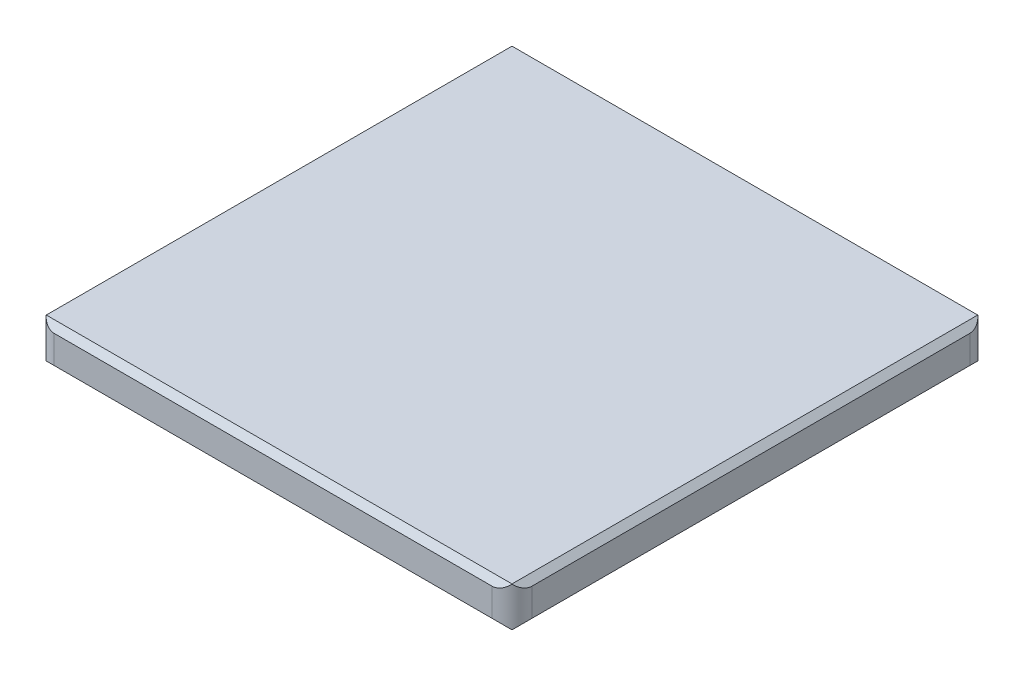
ISO-10303-21;
HEADER;
FILE_DESCRIPTION(('STEP AP214'),'2;1');
FILE_NAME('part.step','',(''),(''),'','','');
FILE_SCHEMA(('AUTOMOTIVE_DESIGN { 1 0 10303 214 1 1 1 1 }'));
ENDSEC;
DATA;
#1=APPLICATION_CONTEXT('core data for automotive mechanical design processes');
#2=APPLICATION_PROTOCOL_DEFINITION('international standard','automotive_design',2000,#1);
#3=PRODUCT_CONTEXT('',#1,'mechanical');
#4=PRODUCT('Part','Part','',(#3));
#5=PRODUCT_RELATED_PRODUCT_CATEGORY('part','',(#4));
#6=PRODUCT_DEFINITION_FORMATION('','',#4);
#7=PRODUCT_DEFINITION_CONTEXT('part definition',#1,'design');
#8=PRODUCT_DEFINITION('design','',#6,#7);
#9=PRODUCT_DEFINITION_SHAPE('','',#8);
#10=(LENGTH_UNIT() NAMED_UNIT(*) SI_UNIT(.MILLI.,.METRE.));
#11=(NAMED_UNIT(*) PLANE_ANGLE_UNIT() SI_UNIT($,.RADIAN.));
#12=(NAMED_UNIT(*) SI_UNIT($,.STERADIAN.) SOLID_ANGLE_UNIT());
#13=UNCERTAINTY_MEASURE_WITH_UNIT(LENGTH_MEASURE(1.E-05),#10,'distance_accuracy_value','');
#14=(GEOMETRIC_REPRESENTATION_CONTEXT(3) GLOBAL_UNCERTAINTY_ASSIGNED_CONTEXT((#13)) GLOBAL_UNIT_ASSIGNED_CONTEXT((#10,
#11,#12)) REPRESENTATION_CONTEXT('',''));
#15=CARTESIAN_POINT('',(0.,0.,0.));
#16=DIRECTION('',(0.,0.,1.));
#17=DIRECTION('',(1.,0.,0.));
#18=AXIS2_PLACEMENT_3D('',#15,#16,#17);
#19=CARTESIAN_POINT('',(152.4,3.81,152.4));
#20=DIRECTION('',(-0.707106781186547,0.707106781186548,0.));
#21=DIRECTION('',(0.,0.,-1.));
#22=AXIS2_PLACEMENT_3D('',#19,#20,#21);
#23=PLANE('',#22);
#24=DIRECTION('',(-0.577350269189625,-0.577350269189624,0.577350269189628));
#25=VECTOR('',#24,1.);
#26=CARTESIAN_POINT('',(152.4,3.81,-152.4));
#27=LINE('',#26,#25);
#28=CARTESIAN_POINT('',(148.680256121069,0.0902561210691833,-148.680256121069));
#29=VERTEX_POINT('',#28);
#30=CARTESIAN_POINT('',(148.59,0.,-148.59));
#31=VERTEX_POINT('',#30);
#32=EDGE_CURVE('E159',#29,#31,#27,.T.);
#33=ORIENTED_EDGE('',*,*,#32,.F.);
#34=CARTESIAN_POINT('',(139.7,-8.88999999999997,-139.7));
#35=DIRECTION('',(-0.707106781186547,0.707106781186548,0.));
#36=DIRECTION('',(-0.707106781186548,-0.707106781186547,0.));
#37=AXIS2_PLACEMENT_3D('',#34,#35,#36);
#38=ELLIPSE('',#37,17.9605122421383,12.7);
#39=CARTESIAN_POINT('',(152.4,3.81,-139.7));
#40=VERTEX_POINT('',#39);
#41=EDGE_CURVE('E273',#29,#40,#38,.F.);
#42=ORIENTED_EDGE('',*,*,#41,.T.);
#43=DIRECTION('',(0.,0.,-1.));
#44=VECTOR('',#43,1.);
#45=CARTESIAN_POINT('',(152.4,3.81,152.4));
#46=LINE('',#45,#44);
#47=CARTESIAN_POINT('',(152.4,3.81,139.7));
#48=VERTEX_POINT('',#47);
#49=EDGE_CURVE('E205',#48,#40,#46,.T.);
#50=ORIENTED_EDGE('',*,*,#49,.F.);
#51=CARTESIAN_POINT('',(139.7,-8.88999999999997,139.7));
#52=DIRECTION('',(-0.707106781186547,0.707106781186548,0.));
#53=DIRECTION('',(-0.707106781186548,-0.707106781186547,0.));
#54=AXIS2_PLACEMENT_3D('',#51,#52,#53);
#55=ELLIPSE('',#54,17.9605122421383,12.7);
#56=CARTESIAN_POINT('',(148.680256121069,0.0902561210691689,148.680256121069));
#57=VERTEX_POINT('',#56);
#58=EDGE_CURVE('E270',#48,#57,#55,.F.);
#59=ORIENTED_EDGE('',*,*,#58,.T.);
#60=DIRECTION('',(-0.577350269189627,-0.577350269189626,-0.577350269189625));
#61=VECTOR('',#60,1.);
#62=CARTESIAN_POINT('',(152.4,3.81,152.4));
#63=LINE('',#62,#61);
#64=CARTESIAN_POINT('',(148.59,0.,148.59));
#65=VERTEX_POINT('',#64);
#66=EDGE_CURVE('E172',#57,#65,#63,.T.);
#67=ORIENTED_EDGE('',*,*,#66,.T.);
#68=DIRECTION('',(0.,0.,1.));
#69=VECTOR('',#68,1.);
#70=CARTESIAN_POINT('',(148.59,0.,0.));
#71=LINE('',#70,#69);
#72=EDGE_CURVE('E178',#31,#65,#71,.T.);
#73=ORIENTED_EDGE('',*,*,#72,.F.);
#74=EDGE_LOOP('',(#33,#42,#50,#59,#67,#73));
#75=FACE_BOUND('',#74,.T.);
#76=ADVANCED_FACE('F45',(#75),#23,.F.);
#77=CARTESIAN_POINT('',(152.4,3.81,152.4));
#78=DIRECTION('',(0.,0.707106781186547,-0.707106781186548));
#79=DIRECTION('',(1.,0.,0.));
#80=AXIS2_PLACEMENT_3D('',#77,#78,#79);
#81=PLANE('',#80);
#82=ORIENTED_EDGE('',*,*,#66,.F.);
#83=CARTESIAN_POINT('',(139.7,-8.89000000000001,139.7));
#84=DIRECTION('',(0.,0.707106781186547,-0.707106781186548));
#85=DIRECTION('',(0.,-0.707106781186548,-0.707106781186547));
#86=AXIS2_PLACEMENT_3D('',#83,#84,#85);
#87=ELLIPSE('',#86,17.9605122421383,12.7);
#88=CARTESIAN_POINT('',(139.7,3.81,152.4));
#89=VERTEX_POINT('',#88);
#90=EDGE_CURVE('E298',#57,#89,#87,.F.);
#91=ORIENTED_EDGE('',*,*,#90,.T.);
#92=DIRECTION('',(1.,0.,0.));
#93=VECTOR('',#92,1.);
#94=CARTESIAN_POINT('',(152.4,3.81,152.4));
#95=LINE('',#94,#93);
#96=CARTESIAN_POINT('',(-139.7,3.81,152.4));
#97=VERTEX_POINT('',#96);
#98=EDGE_CURVE('E201',#97,#89,#95,.T.);
#99=ORIENTED_EDGE('',*,*,#98,.F.);
#100=CARTESIAN_POINT('',(-139.7,-8.89000000000001,139.7));
#101=DIRECTION('',(0.,0.707106781186547,-0.707106781186548));
#102=DIRECTION('',(0.,-0.707106781186548,-0.707106781186547));
#103=AXIS2_PLACEMENT_3D('',#100,#101,#102);
#104=ELLIPSE('',#103,17.9605122421383,12.7);
#105=CARTESIAN_POINT('',(-148.680256121069,0.0902561210691655,148.680256121069));
#106=VERTEX_POINT('',#105);
#107=EDGE_CURVE('E295',#97,#106,#104,.F.);
#108=ORIENTED_EDGE('',*,*,#107,.T.);
#109=DIRECTION('',(0.577350269189627,-0.577350269189626,-0.577350269189625));
#110=VECTOR('',#109,1.);
#111=CARTESIAN_POINT('',(-50.7999999999996,-97.7900000000002,50.8));
#112=LINE('',#111,#110);
#113=CARTESIAN_POINT('',(-148.59,0.,148.59));
#114=VERTEX_POINT('',#113);
#115=EDGE_CURVE('E212',#106,#114,#112,.T.);
#116=ORIENTED_EDGE('',*,*,#115,.T.);
#117=DIRECTION('',(-1.,0.,0.));
#118=VECTOR('',#117,1.);
#119=CARTESIAN_POINT('',(0.,0.,148.59));
#120=LINE('',#119,#118);
#121=EDGE_CURVE('E187',#65,#114,#120,.T.);
#122=ORIENTED_EDGE('',*,*,#121,.F.);
#123=EDGE_LOOP('',(#82,#91,#99,#108,#116,#122));
#124=FACE_BOUND('',#123,.T.);
#125=ADVANCED_FACE('F378',(#124),#81,.F.);
#126=CARTESIAN_POINT('',(-152.4,3.81,152.4));
#127=DIRECTION('',(0.707106781186547,0.707106781186548,0.));
#128=DIRECTION('',(0.,0.,1.));
#129=AXIS2_PLACEMENT_3D('',#126,#127,#128);
#130=PLANE('',#129);
#131=ORIENTED_EDGE('',*,*,#115,.F.);
#132=CARTESIAN_POINT('',(-139.7,-8.88999999999997,139.7));
#133=DIRECTION('',(0.707106781186547,0.707106781186548,0.));
#134=DIRECTION('',(0.707106781186548,-0.707106781186547,0.));
#135=AXIS2_PLACEMENT_3D('',#132,#133,#134);
#136=ELLIPSE('',#135,17.9605122421383,12.7);
#137=CARTESIAN_POINT('',(-152.4,3.81,139.7));
#138=VERTEX_POINT('',#137);
#139=EDGE_CURVE('E317',#106,#138,#136,.F.);
#140=ORIENTED_EDGE('',*,*,#139,.T.);
#141=DIRECTION('',(0.,0.,1.));
#142=VECTOR('',#141,1.);
#143=CARTESIAN_POINT('',(-152.4,3.81,152.4));
#144=LINE('',#143,#142);
#145=CARTESIAN_POINT('',(-152.4,3.81,-139.7));
#146=VERTEX_POINT('',#145);
#147=EDGE_CURVE('E182',#146,#138,#144,.T.);
#148=ORIENTED_EDGE('',*,*,#147,.F.);
#149=CARTESIAN_POINT('',(-139.7,-8.88999999999997,-139.7));
#150=DIRECTION('',(0.707106781186547,0.707106781186548,0.));
#151=DIRECTION('',(0.707106781186548,-0.707106781186547,0.));
#152=AXIS2_PLACEMENT_3D('',#149,#150,#151);
#153=ELLIPSE('',#152,17.9605122421383,12.7);
#154=CARTESIAN_POINT('',(-148.680256121069,0.0902561210692349,-148.680256121069));
#155=VERTEX_POINT('',#154);
#156=EDGE_CURVE('E314',#146,#155,#153,.F.);
#157=ORIENTED_EDGE('',*,*,#156,.T.);
#158=DIRECTION('',(0.577350269189625,-0.577350269189625,0.577350269189628));
#159=VECTOR('',#158,1.);
#160=CARTESIAN_POINT('',(-50.7999999999998,-97.79,-50.7999999999994));
#161=LINE('',#160,#159);
#162=CARTESIAN_POINT('',(-148.59,0.,-148.59));
#163=VERTEX_POINT('',#162);
#164=EDGE_CURVE('E209',#155,#163,#161,.T.);
#165=ORIENTED_EDGE('',*,*,#164,.T.);
#166=DIRECTION('',(0.,0.,-1.));
#167=VECTOR('',#166,1.);
#168=CARTESIAN_POINT('',(-148.59,0.,0.));
#169=LINE('',#168,#167);
#170=EDGE_CURVE('E180',#114,#163,#169,.T.);
#171=ORIENTED_EDGE('',*,*,#170,.F.);
#172=EDGE_LOOP('',(#131,#140,#148,#157,#165,#171));
#173=FACE_BOUND('',#172,.T.);
#174=ADVANCED_FACE('F332',(#173),#130,.F.);
#175=CARTESIAN_POINT('',(152.4,3.81,-152.4));
#176=DIRECTION('',(0.,0.707106781186549,0.707106781186546));
#177=DIRECTION('',(-1.,0.,0.));
#178=AXIS2_PLACEMENT_3D('',#175,#176,#177);
#179=PLANE('',#178);
#180=DIRECTION('',(-1.,0.,0.));
#181=VECTOR('',#180,1.);
#182=CARTESIAN_POINT('',(152.4,3.81,-152.4));
#183=LINE('',#182,#181);
#184=CARTESIAN_POINT('',(139.7,3.81,-152.4));
#185=VERTEX_POINT('',#184);
#186=CARTESIAN_POINT('',(-139.7,3.81,-152.4));
#187=VERTEX_POINT('',#186);
#188=EDGE_CURVE('E188',#185,#187,#183,.T.);
#189=ORIENTED_EDGE('',*,*,#188,.F.);
#190=CARTESIAN_POINT('',(139.7,-8.88999999999992,-139.7));
#191=DIRECTION('',(0.,0.707106781186549,0.707106781186546));
#192=DIRECTION('',(0.,-0.707106781186546,0.707106781186549));
#193=AXIS2_PLACEMENT_3D('',#190,#191,#192);
#194=ELLIPSE('',#193,17.9605122421383,12.7);
#195=EDGE_CURVE('E166',#185,#29,#194,.F.);
#196=ORIENTED_EDGE('',*,*,#195,.T.);
#197=ORIENTED_EDGE('',*,*,#32,.T.);
#198=DIRECTION('',(1.,0.,0.));
#199=VECTOR('',#198,1.);
#200=CARTESIAN_POINT('',(0.,0.,-148.59));
#201=LINE('',#200,#199);
#202=EDGE_CURVE('E164',#163,#31,#201,.T.);
#203=ORIENTED_EDGE('',*,*,#202,.F.);
#204=ORIENTED_EDGE('',*,*,#164,.F.);
#205=CARTESIAN_POINT('',(-139.7,-8.88999999999992,-139.7));
#206=DIRECTION('',(0.,0.707106781186549,0.707106781186546));
#207=DIRECTION('',(0.,-0.707106781186546,0.707106781186549));
#208=AXIS2_PLACEMENT_3D('',#205,#206,#207);
#209=ELLIPSE('',#208,17.9605122421383,12.7);
#210=EDGE_CURVE('E265',#155,#187,#209,.F.);
#211=ORIENTED_EDGE('',*,*,#210,.T.);
#212=EDGE_LOOP('',(#189,#196,#197,#203,#204,#211));
#213=FACE_BOUND('',#212,.T.);
#214=ADVANCED_FACE('F162',(#213),#179,.F.);
#215=CARTESIAN_POINT('',(-152.4,25.4,152.4));
#216=DIRECTION('',(1.,0.,0.));
#217=DIRECTION('',(0.,0.,-1.));
#218=AXIS2_PLACEMENT_3D('',#215,#216,#217);
#219=PLANE('',#218);
#220=ORIENTED_EDGE('',*,*,#147,.T.);
#221=DIRECTION('',(0.,-1.,0.));
#222=VECTOR('',#221,1.);
#223=CARTESIAN_POINT('',(-152.4,25.4,139.7));
#224=LINE('',#223,#222);
#225=CARTESIAN_POINT('',(-152.4,21.59,139.7));
#226=VERTEX_POINT('',#225);
#227=EDGE_CURVE('E67',#138,#226,#224,.F.);
#228=ORIENTED_EDGE('',*,*,#227,.T.);
#229=DIRECTION('',(0.,0.,-1.));
#230=VECTOR('',#229,1.);
#231=CARTESIAN_POINT('',(-152.4,21.59,-152.4));
#232=LINE('',#231,#230);
#233=CARTESIAN_POINT('',(-152.4,21.59,-139.7));
#234=VERTEX_POINT('',#233);
#235=EDGE_CURVE('E242',#226,#234,#232,.T.);
#236=ORIENTED_EDGE('',*,*,#235,.T.);
#237=DIRECTION('',(0.,-1.,0.));
#238=VECTOR('',#237,1.);
#239=CARTESIAN_POINT('',(-152.4,25.4,-139.7));
#240=LINE('',#239,#238);
#241=EDGE_CURVE('E320',#234,#146,#240,.T.);
#242=ORIENTED_EDGE('',*,*,#241,.T.);
#243=EDGE_LOOP('',(#220,#228,#236,#242));
#244=FACE_BOUND('',#243,.T.);
#245=ADVANCED_FACE('F328',(#244),#219,.F.);
#246=CARTESIAN_POINT('',(152.4,25.4,152.4));
#247=DIRECTION('',(0.,0.,-1.));
#248=DIRECTION('',(-1.,0.,0.));
#249=AXIS2_PLACEMENT_3D('',#246,#247,#248);
#250=PLANE('',#249);
#251=ORIENTED_EDGE('',*,*,#98,.T.);
#252=DIRECTION('',(0.,-1.,0.));
#253=VECTOR('',#252,1.);
#254=CARTESIAN_POINT('',(139.7,25.4,152.4));
#255=LINE('',#254,#253);
#256=CARTESIAN_POINT('',(139.7,21.59,152.4));
#257=VERTEX_POINT('',#256);
#258=EDGE_CURVE('E305',#89,#257,#255,.F.);
#259=ORIENTED_EDGE('',*,*,#258,.T.);
#260=DIRECTION('',(-1.,0.,0.));
#261=VECTOR('',#260,1.);
#262=CARTESIAN_POINT('',(-152.4,21.59,152.4));
#263=LINE('',#262,#261);
#264=CARTESIAN_POINT('',(-139.7,21.59,152.4));
#265=VERTEX_POINT('',#264);
#266=EDGE_CURVE('E238',#257,#265,#263,.T.);
#267=ORIENTED_EDGE('',*,*,#266,.T.);
#268=DIRECTION('',(0.,-1.,0.));
#269=VECTOR('',#268,1.);
#270=CARTESIAN_POINT('',(-139.7,25.4,152.4));
#271=LINE('',#270,#269);
#272=EDGE_CURVE('E301',#265,#97,#271,.T.);
#273=ORIENTED_EDGE('',*,*,#272,.T.);
#274=EDGE_LOOP('',(#251,#259,#267,#273));
#275=FACE_BOUND('',#274,.T.);
#276=ADVANCED_FACE('F381',(#275),#250,.F.);
#277=CARTESIAN_POINT('',(152.4,25.4,152.4));
#278=DIRECTION('',(-1.,0.,0.));
#279=DIRECTION('',(0.,0.,1.));
#280=AXIS2_PLACEMENT_3D('',#277,#278,#279);
#281=PLANE('',#280);
#282=ORIENTED_EDGE('',*,*,#49,.T.);
#283=DIRECTION('',(0.,-1.,0.));
#284=VECTOR('',#283,1.);
#285=CARTESIAN_POINT('',(152.4,25.4,-139.7));
#286=LINE('',#285,#284);
#287=CARTESIAN_POINT('',(152.4,21.59,-139.7));
#288=VERTEX_POINT('',#287);
#289=EDGE_CURVE('E280',#40,#288,#286,.F.);
#290=ORIENTED_EDGE('',*,*,#289,.T.);
#291=DIRECTION('',(0.,0.,1.));
#292=VECTOR('',#291,1.);
#293=CARTESIAN_POINT('',(152.4,21.59,152.4));
#294=LINE('',#293,#292);
#295=CARTESIAN_POINT('',(152.4,21.59,139.7));
#296=VERTEX_POINT('',#295);
#297=EDGE_CURVE('E234',#288,#296,#294,.T.);
#298=ORIENTED_EDGE('',*,*,#297,.T.);
#299=DIRECTION('',(0.,-1.,0.));
#300=VECTOR('',#299,1.);
#301=CARTESIAN_POINT('',(152.4,25.4,139.7));
#302=LINE('',#301,#300);
#303=EDGE_CURVE('E276',#296,#48,#302,.T.);
#304=ORIENTED_EDGE('',*,*,#303,.T.);
#305=EDGE_LOOP('',(#282,#290,#298,#304));
#306=FACE_BOUND('',#305,.T.);
#307=ADVANCED_FACE('F368',(#306),#281,.F.);
#308=CARTESIAN_POINT('',(152.4,25.4,-152.4));
#309=DIRECTION('',(0.,0.,1.));
#310=DIRECTION('',(1.,0.,0.));
#311=AXIS2_PLACEMENT_3D('',#308,#309,#310);
#312=PLANE('',#311);
#313=DIRECTION('',(1.,0.,0.));
#314=VECTOR('',#313,1.);
#315=CARTESIAN_POINT('',(152.4,21.59,-152.4));
#316=LINE('',#315,#314);
#317=CARTESIAN_POINT('',(-139.7,21.59,-152.4));
#318=VERTEX_POINT('',#317);
#319=CARTESIAN_POINT('',(139.7,21.59,-152.4));
#320=VERTEX_POINT('',#319);
#321=EDGE_CURVE('E230',#318,#320,#316,.T.);
#322=ORIENTED_EDGE('',*,*,#321,.T.);
#323=DIRECTION('',(0.,-1.,0.));
#324=VECTOR('',#323,1.);
#325=CARTESIAN_POINT('',(139.7,25.4,-152.4));
#326=LINE('',#325,#324);
#327=EDGE_CURVE('E261',#320,#185,#326,.T.);
#328=ORIENTED_EDGE('',*,*,#327,.T.);
#329=ORIENTED_EDGE('',*,*,#188,.T.);
#330=DIRECTION('',(0.,-1.,0.));
#331=VECTOR('',#330,1.);
#332=CARTESIAN_POINT('',(-139.7,25.4,-152.4));
#333=LINE('',#332,#331);
#334=EDGE_CURVE('E245',#187,#318,#333,.F.);
#335=ORIENTED_EDGE('',*,*,#334,.T.);
#336=EDGE_LOOP('',(#322,#328,#329,#335));
#337=FACE_BOUND('',#336,.T.);
#338=ADVANCED_FACE('F361',(#337),#312,.F.);
#339=CARTESIAN_POINT('',(0.,25.4,0.));
#340=DIRECTION('',(0.,1.,0.));
#341=DIRECTION('',(0.,0.,1.));
#342=AXIS2_PLACEMENT_3D('',#339,#340,#341);
#343=PLANE('',#342);
#344=DIRECTION('',(0.,0.,-1.));
#345=VECTOR('',#344,1.);
#346=CARTESIAN_POINT('',(148.59,25.4,-152.4));
#347=LINE('',#346,#345);
#348=CARTESIAN_POINT('',(148.59,25.4,148.59));
#349=VERTEX_POINT('',#348);
#350=CARTESIAN_POINT('',(148.59,25.4,-148.59));
#351=VERTEX_POINT('',#350);
#352=EDGE_CURVE('E223',#349,#351,#347,.T.);
#353=ORIENTED_EDGE('',*,*,#352,.T.);
#354=DIRECTION('',(-1.,0.,0.));
#355=VECTOR('',#354,1.);
#356=CARTESIAN_POINT('',(-152.4,25.4,-148.59));
#357=LINE('',#356,#355);
#358=CARTESIAN_POINT('',(-148.59,25.4,-148.59));
#359=VERTEX_POINT('',#358);
#360=EDGE_CURVE('E226',#351,#359,#357,.T.);
#361=ORIENTED_EDGE('',*,*,#360,.T.);
#362=DIRECTION('',(0.,0.,1.));
#363=VECTOR('',#362,1.);
#364=CARTESIAN_POINT('',(-148.59,25.4,152.4));
#365=LINE('',#364,#363);
#366=CARTESIAN_POINT('',(-148.59,25.4,148.59));
#367=VERTEX_POINT('',#366);
#368=EDGE_CURVE('E171',#359,#367,#365,.T.);
#369=ORIENTED_EDGE('',*,*,#368,.T.);
#370=DIRECTION('',(1.,0.,0.));
#371=VECTOR('',#370,1.);
#372=CARTESIAN_POINT('',(152.4,25.4,148.59));
#373=LINE('',#372,#371);
#374=EDGE_CURVE('E220',#367,#349,#373,.T.);
#375=ORIENTED_EDGE('',*,*,#374,.T.);
#376=EDGE_LOOP('',(#353,#361,#369,#375));
#377=FACE_BOUND('',#376,.T.);
#378=ADVANCED_FACE('F349',(#377),#343,.T.);
#379=CARTESIAN_POINT('',(0.,0.,0.));
#380=DIRECTION('',(0.,1.,0.));
#381=DIRECTION('',(0.,0.,1.));
#382=AXIS2_PLACEMENT_3D('',#379,#380,#381);
#383=PLANE('',#382);
#384=ORIENTED_EDGE('',*,*,#170,.T.);
#385=ORIENTED_EDGE('',*,*,#202,.T.);
#386=ORIENTED_EDGE('',*,*,#72,.T.);
#387=ORIENTED_EDGE('',*,*,#121,.T.);
#388=EDGE_LOOP('',(#384,#385,#386,#387));
#389=FACE_BOUND('',#388,.T.);
#390=ADVANCED_FACE('F176',(#389),#383,.F.);
#391=CARTESIAN_POINT('',(0.,25.4,148.59));
#392=DIRECTION('',(0.,0.707106781186549,0.707106781186546));
#393=DIRECTION('',(-1.,0.,0.));
#394=AXIS2_PLACEMENT_3D('',#391,#392,#393);
#395=PLANE('',#394);
#396=ORIENTED_EDGE('',*,*,#266,.F.);
#397=CARTESIAN_POINT('',(139.7,34.29,139.7));
#398=DIRECTION('',(0.,0.707106781186549,0.707106781186546));
#399=DIRECTION('',(0.,-0.707106781186546,0.707106781186549));
#400=AXIS2_PLACEMENT_3D('',#397,#398,#399);
#401=ELLIPSE('',#400,17.9605122421383,12.7);
#402=CARTESIAN_POINT('',(148.680256121069,25.3097438789309,148.680256121069));
#403=VERTEX_POINT('',#402);
#404=EDGE_CURVE('E311',#257,#403,#401,.T.);
#405=ORIENTED_EDGE('',*,*,#404,.T.);
#406=DIRECTION('',(-0.577350269189625,0.577350269189625,-0.577350269189627));
#407=VECTOR('',#406,1.);
#408=CARTESIAN_POINT('',(99.0600000000002,74.9299999999999,99.0599999999999));
#409=LINE('',#408,#407);
#410=EDGE_CURVE('E194',#349,#403,#409,.F.);
#411=ORIENTED_EDGE('',*,*,#410,.F.);
#412=ORIENTED_EDGE('',*,*,#374,.F.);
#413=DIRECTION('',(0.577350269189625,0.577350269189625,-0.577350269189627));
#414=VECTOR('',#413,1.);
#415=CARTESIAN_POINT('',(-99.06,74.9300000000001,99.0599999999998));
#416=LINE('',#415,#414);
#417=CARTESIAN_POINT('',(-148.680256121069,25.3097438789309,148.680256121069));
#418=VERTEX_POINT('',#417);
#419=EDGE_CURVE('E253',#418,#367,#416,.T.);
#420=ORIENTED_EDGE('',*,*,#419,.F.);
#421=CARTESIAN_POINT('',(-139.7,34.29,139.7));
#422=DIRECTION('',(0.,0.707106781186549,0.707106781186546));
#423=DIRECTION('',(0.,-0.707106781186546,0.707106781186549));
#424=AXIS2_PLACEMENT_3D('',#421,#422,#423);
#425=ELLIPSE('',#424,17.9605122421383,12.7);
#426=EDGE_CURVE('E308',#418,#265,#425,.T.);
#427=ORIENTED_EDGE('',*,*,#426,.T.);
#428=EDGE_LOOP('',(#396,#405,#411,#412,#420,#427));
#429=FACE_BOUND('',#428,.T.);
#430=ADVANCED_FACE('F345',(#429),#395,.T.);
#431=CARTESIAN_POINT('',(148.59,25.4,0.));
#432=DIRECTION('',(0.707106781186548,0.707106781186548,0.));
#433=DIRECTION('',(0.,0.,1.));
#434=AXIS2_PLACEMENT_3D('',#431,#432,#433);
#435=PLANE('',#434);
#436=ORIENTED_EDGE('',*,*,#297,.F.);
#437=CARTESIAN_POINT('',(139.7,34.29,-139.7));
#438=DIRECTION('',(0.707106781186548,0.707106781186548,0.));
#439=DIRECTION('',(0.707106781186548,-0.707106781186548,0.));
#440=AXIS2_PLACEMENT_3D('',#437,#438,#439);
#441=ELLIPSE('',#440,17.9605122421383,12.7);
#442=CARTESIAN_POINT('',(148.680256121069,25.3097438789309,-148.680256121069));
#443=VERTEX_POINT('',#442);
#444=EDGE_CURVE('E286',#288,#443,#441,.T.);
#445=ORIENTED_EDGE('',*,*,#444,.T.);
#446=DIRECTION('',(-0.577350269189626,0.577350269189626,0.577350269189624));
#447=VECTOR('',#446,1.);
#448=CARTESIAN_POINT('',(99.0600000000001,74.93,-99.0600000000003));
#449=LINE('',#448,#447);
#450=EDGE_CURVE('E249',#351,#443,#449,.F.);
#451=ORIENTED_EDGE('',*,*,#450,.F.);
#452=ORIENTED_EDGE('',*,*,#352,.F.);
#453=ORIENTED_EDGE('',*,*,#410,.T.);
#454=CARTESIAN_POINT('',(139.7,34.29,139.7));
#455=DIRECTION('',(0.707106781186548,0.707106781186548,0.));
#456=DIRECTION('',(0.707106781186548,-0.707106781186548,0.));
#457=AXIS2_PLACEMENT_3D('',#454,#455,#456);
#458=ELLIPSE('',#457,17.9605122421383,12.7);
#459=EDGE_CURVE('E283',#403,#296,#458,.T.);
#460=ORIENTED_EDGE('',*,*,#459,.T.);
#461=EDGE_LOOP('',(#436,#445,#451,#452,#453,#460));
#462=FACE_BOUND('',#461,.T.);
#463=ADVANCED_FACE('F383',(#462),#435,.T.);
#464=CARTESIAN_POINT('',(-148.59,25.4,0.));
#465=DIRECTION('',(-0.707106781186548,0.707106781186548,0.));
#466=DIRECTION('',(0.,0.,-1.));
#467=AXIS2_PLACEMENT_3D('',#464,#465,#466);
#468=PLANE('',#467);
#469=ORIENTED_EDGE('',*,*,#235,.F.);
#470=CARTESIAN_POINT('',(-139.7,34.29,139.7));
#471=DIRECTION('',(-0.707106781186548,0.707106781186548,0.));
#472=DIRECTION('',(-0.707106781186548,-0.707106781186548,0.));
#473=AXIS2_PLACEMENT_3D('',#470,#471,#472);
#474=ELLIPSE('',#473,17.9605122421383,12.7);
#475=EDGE_CURVE('E13',#226,#418,#474,.T.);
#476=ORIENTED_EDGE('',*,*,#475,.T.);
#477=ORIENTED_EDGE('',*,*,#419,.T.);
#478=ORIENTED_EDGE('',*,*,#368,.F.);
#479=DIRECTION('',(-0.577350269189627,-0.577350269189627,-0.577350269189624));
#480=VECTOR('',#479,1.);
#481=CARTESIAN_POINT('',(-99.0600000000001,74.9299999999999,-99.0600000000003));
#482=LINE('',#481,#480);
#483=CARTESIAN_POINT('',(-148.680256121069,25.3097438789308,-148.680256121069));
#484=VERTEX_POINT('',#483);
#485=EDGE_CURVE('E246',#484,#359,#482,.F.);
#486=ORIENTED_EDGE('',*,*,#485,.F.);
#487=CARTESIAN_POINT('',(-139.7,34.29,-139.7));
#488=DIRECTION('',(-0.707106781186548,0.707106781186548,0.));
#489=DIRECTION('',(-0.707106781186548,-0.707106781186548,0.));
#490=AXIS2_PLACEMENT_3D('',#487,#488,#489);
#491=ELLIPSE('',#490,17.9605122421383,12.7);
#492=EDGE_CURVE('E54',#484,#234,#491,.T.);
#493=ORIENTED_EDGE('',*,*,#492,.T.);
#494=EDGE_LOOP('',(#469,#476,#477,#478,#486,#493));
#495=FACE_BOUND('',#494,.T.);
#496=ADVANCED_FACE('F340',(#495),#468,.T.);
#497=CARTESIAN_POINT('',(0.,25.4,-148.59));
#498=DIRECTION('',(0.,0.707106781186546,-0.707106781186549));
#499=DIRECTION('',(1.,0.,0.));
#500=AXIS2_PLACEMENT_3D('',#497,#498,#499);
#501=PLANE('',#500);
#502=ORIENTED_EDGE('',*,*,#450,.T.);
#503=CARTESIAN_POINT('',(139.7,34.29,-139.7));
#504=DIRECTION('',(0.,0.707106781186546,-0.707106781186549));
#505=DIRECTION('',(0.,-0.707106781186549,-0.707106781186546));
#506=AXIS2_PLACEMENT_3D('',#503,#504,#505);
#507=ELLIPSE('',#506,17.9605122421383,12.7);
#508=EDGE_CURVE('E292',#443,#320,#507,.T.);
#509=ORIENTED_EDGE('',*,*,#508,.T.);
#510=ORIENTED_EDGE('',*,*,#321,.F.);
#511=CARTESIAN_POINT('',(-139.7,34.2900000000001,-139.7));
#512=DIRECTION('',(0.,0.707106781186546,-0.707106781186549));
#513=DIRECTION('',(0.,-0.707106781186549,-0.707106781186546));
#514=AXIS2_PLACEMENT_3D('',#511,#512,#513);
#515=ELLIPSE('',#514,17.9605122421383,12.7);
#516=EDGE_CURVE('E289',#318,#484,#515,.T.);
#517=ORIENTED_EDGE('',*,*,#516,.T.);
#518=ORIENTED_EDGE('',*,*,#485,.T.);
#519=ORIENTED_EDGE('',*,*,#360,.F.);
#520=EDGE_LOOP('',(#502,#509,#510,#517,#518,#519));
#521=FACE_BOUND('',#520,.T.);
#522=ADVANCED_FACE('F357',(#521),#501,.T.);
#523=CARTESIAN_POINT('',(139.7,25.4,-139.7));
#524=DIRECTION('',(0.,-1.,0.));
#525=DIRECTION('',(0.,0.,-1.));
#526=AXIS2_PLACEMENT_3D('',#523,#524,#525);
#527=CYLINDRICAL_SURFACE('',#526,12.7);
#528=ORIENTED_EDGE('',*,*,#444,.F.);
#529=ORIENTED_EDGE('',*,*,#289,.F.);
#530=ORIENTED_EDGE('',*,*,#41,.F.);
#531=ORIENTED_EDGE('',*,*,#195,.F.);
#532=ORIENTED_EDGE('',*,*,#327,.F.);
#533=ORIENTED_EDGE('',*,*,#508,.F.);
#534=EDGE_LOOP('',(#528,#529,#530,#531,#532,#533));
#535=FACE_BOUND('',#534,.T.);
#536=ADVANCED_FACE('F364',(#535),#527,.T.);
#537=CARTESIAN_POINT('',(139.7,25.4,139.7));
#538=DIRECTION('',(0.,-1.,0.));
#539=DIRECTION('',(0.,0.,-1.));
#540=AXIS2_PLACEMENT_3D('',#537,#538,#539);
#541=CYLINDRICAL_SURFACE('',#540,12.7);
#542=ORIENTED_EDGE('',*,*,#404,.F.);
#543=ORIENTED_EDGE('',*,*,#258,.F.);
#544=ORIENTED_EDGE('',*,*,#90,.F.);
#545=ORIENTED_EDGE('',*,*,#58,.F.);
#546=ORIENTED_EDGE('',*,*,#303,.F.);
#547=ORIENTED_EDGE('',*,*,#459,.F.);
#548=EDGE_LOOP('',(#542,#543,#544,#545,#546,#547));
#549=FACE_BOUND('',#548,.T.);
#550=ADVANCED_FACE('F374',(#549),#541,.T.);
#551=CARTESIAN_POINT('',(-139.7,25.4,139.7));
#552=DIRECTION('',(0.,-1.,0.));
#553=DIRECTION('',(0.,0.,-1.));
#554=AXIS2_PLACEMENT_3D('',#551,#552,#553);
#555=CYLINDRICAL_SURFACE('',#554,12.7);
#556=ORIENTED_EDGE('',*,*,#475,.F.);
#557=ORIENTED_EDGE('',*,*,#227,.F.);
#558=ORIENTED_EDGE('',*,*,#139,.F.);
#559=ORIENTED_EDGE('',*,*,#107,.F.);
#560=ORIENTED_EDGE('',*,*,#272,.F.);
#561=ORIENTED_EDGE('',*,*,#426,.F.);
#562=EDGE_LOOP('',(#556,#557,#558,#559,#560,#561));
#563=FACE_BOUND('',#562,.T.);
#564=ADVANCED_FACE('F336',(#563),#555,.T.);
#565=CARTESIAN_POINT('',(-139.7,25.4,-139.7));
#566=DIRECTION('',(0.,-1.,0.));
#567=DIRECTION('',(0.,0.,-1.));
#568=AXIS2_PLACEMENT_3D('',#565,#566,#567);
#569=CYLINDRICAL_SURFACE('',#568,12.7);
#570=ORIENTED_EDGE('',*,*,#516,.F.);
#571=ORIENTED_EDGE('',*,*,#334,.F.);
#572=ORIENTED_EDGE('',*,*,#210,.F.);
#573=ORIENTED_EDGE('',*,*,#156,.F.);
#574=ORIENTED_EDGE('',*,*,#241,.F.);
#575=ORIENTED_EDGE('',*,*,#492,.F.);
#576=EDGE_LOOP('',(#570,#571,#572,#573,#574,#575));
#577=FACE_BOUND('',#576,.T.);
#578=ADVANCED_FACE('F47',(#577),#569,.T.);
#579=CLOSED_SHELL('',(#76,#125,#174,#214,#245,#276,#307,#338,#378,#390,#430,#463,#496,#522,#536,
#550,#564,#578));
#580=MANIFOLD_SOLID_BREP('B2',#579);
#581=ADVANCED_BREP_SHAPE_REPRESENTATION('',(#18,#580),#14);
#582=SHAPE_DEFINITION_REPRESENTATION(#9,#581);
ENDSEC;
END-ISO-10303-21;
